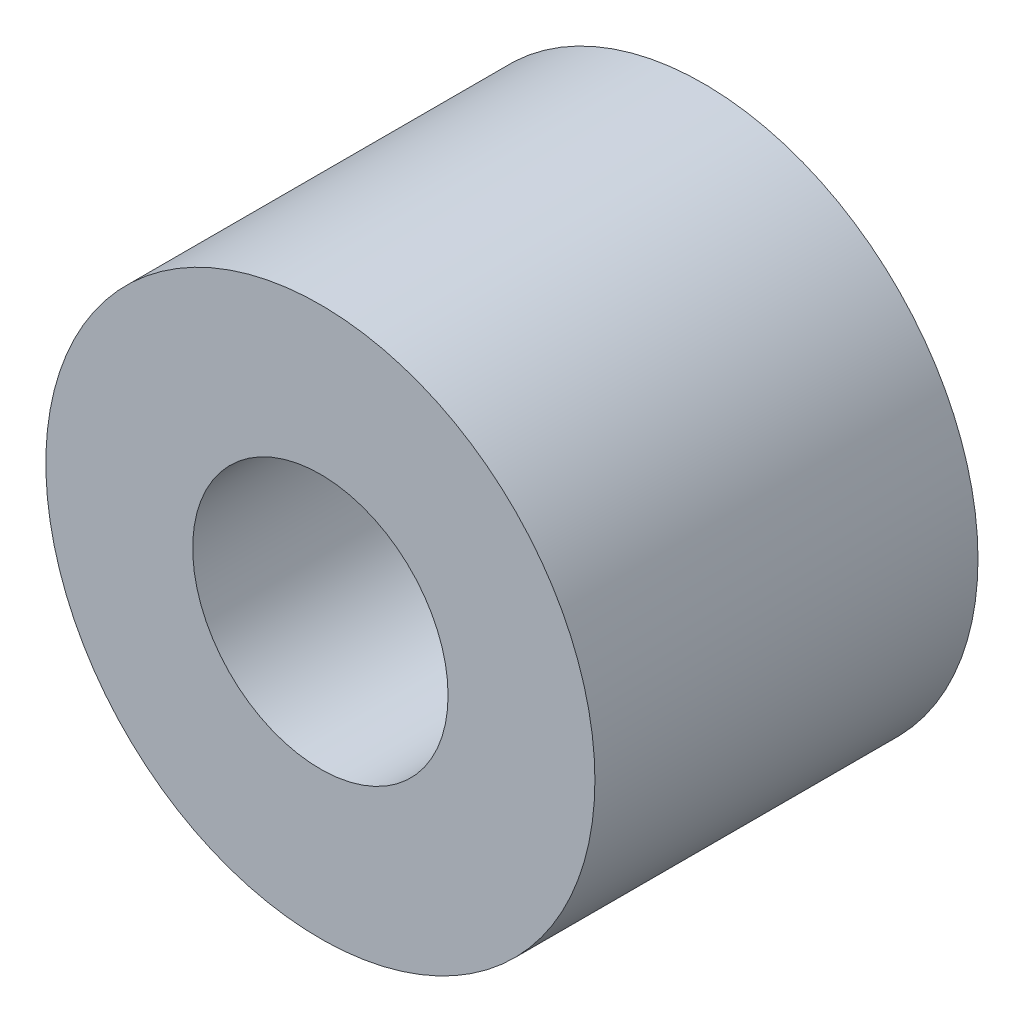
ISO-10303-21;
HEADER;
FILE_DESCRIPTION(('STEP AP214'),'2;1');
FILE_NAME('part.step','',(''),(''),'','','');
FILE_SCHEMA(('AUTOMOTIVE_DESIGN { 1 0 10303 214 1 1 1 1 }'));
ENDSEC;
DATA;
#1=APPLICATION_CONTEXT('core data for automotive mechanical design processes');
#2=APPLICATION_PROTOCOL_DEFINITION('international standard','automotive_design',2000,#1);
#3=PRODUCT_CONTEXT('',#1,'mechanical');
#4=PRODUCT('Part','Part','',(#3));
#5=PRODUCT_RELATED_PRODUCT_CATEGORY('part','',(#4));
#6=PRODUCT_DEFINITION_FORMATION('','',#4);
#7=PRODUCT_DEFINITION_CONTEXT('part definition',#1,'design');
#8=PRODUCT_DEFINITION('design','',#6,#7);
#9=PRODUCT_DEFINITION_SHAPE('','',#8);
#10=(LENGTH_UNIT() NAMED_UNIT(*) SI_UNIT(.MILLI.,.METRE.));
#11=(NAMED_UNIT(*) PLANE_ANGLE_UNIT() SI_UNIT($,.RADIAN.));
#12=(NAMED_UNIT(*) SI_UNIT($,.STERADIAN.) SOLID_ANGLE_UNIT());
#13=UNCERTAINTY_MEASURE_WITH_UNIT(LENGTH_MEASURE(1.E-05),#10,'distance_accuracy_value','');
#14=(GEOMETRIC_REPRESENTATION_CONTEXT(3) GLOBAL_UNCERTAINTY_ASSIGNED_CONTEXT((#13)) GLOBAL_UNIT_ASSIGNED_CONTEXT((#10,
#11,#12)) REPRESENTATION_CONTEXT('',''));
#15=CARTESIAN_POINT('',(0.,0.,0.));
#16=DIRECTION('',(0.,0.,1.));
#17=DIRECTION('',(1.,0.,0.));
#18=AXIS2_PLACEMENT_3D('',#15,#16,#17);
#19=CARTESIAN_POINT('',(0.,0.,762.));
#20=DIRECTION('',(0.,0.,-1.));
#21=DIRECTION('',(-1.,0.,0.));
#22=AXIS2_PLACEMENT_3D('',#19,#20,#21);
#23=CYLINDRICAL_SURFACE('',#22,546.1);
#24=CARTESIAN_POINT('',(0.,0.,762.));
#25=DIRECTION('',(0.,0.,1.));
#26=DIRECTION('',(1.,0.,0.));
#27=AXIS2_PLACEMENT_3D('',#24,#25,#26);
#28=CIRCLE('',#27,546.1);
#29=CARTESIAN_POINT('',(546.1,0.,762.));
#30=VERTEX_POINT('',#29);
#31=EDGE_CURVE('E10',#30,#30,#28,.T.);
#32=ORIENTED_EDGE('',*,*,#31,.F.);
#33=EDGE_LOOP('',(#32));
#34=FACE_BOUND('',#33,.T.);
#35=CARTESIAN_POINT('',(0.,0.,0.));
#36=DIRECTION('',(0.,0.,1.));
#37=DIRECTION('',(1.,0.,0.));
#38=AXIS2_PLACEMENT_3D('',#35,#36,#37);
#39=CIRCLE('',#38,546.1);
#40=CARTESIAN_POINT('',(546.1,0.,0.));
#41=VERTEX_POINT('',#40);
#42=EDGE_CURVE('E33',#41,#41,#39,.T.);
#43=ORIENTED_EDGE('',*,*,#42,.T.);
#44=EDGE_LOOP('',(#43));
#45=FACE_BOUND('',#44,.T.);
#46=ADVANCED_FACE('F30',(#34,#45),#23,.T.);
#47=CARTESIAN_POINT('',(0.,0.,762.));
#48=DIRECTION('',(0.,0.,1.));
#49=DIRECTION('',(1.,0.,0.));
#50=AXIS2_PLACEMENT_3D('',#47,#48,#49);
#51=PLANE('',#50);
#52=CARTESIAN_POINT('',(0.,0.,762.));
#53=DIRECTION('',(0.,0.,1.));
#54=DIRECTION('',(1.,0.,0.));
#55=AXIS2_PLACEMENT_3D('',#52,#53,#54);
#56=CIRCLE('',#55,254.);
#57=CARTESIAN_POINT('',(254.,0.,762.));
#58=VERTEX_POINT('',#57);
#59=EDGE_CURVE('E42',#58,#58,#56,.T.);
#60=ORIENTED_EDGE('',*,*,#59,.F.);
#61=EDGE_LOOP('',(#60));
#62=FACE_BOUND('',#61,.T.);
#63=ORIENTED_EDGE('',*,*,#31,.T.);
#64=EDGE_LOOP('',(#63));
#65=FACE_BOUND('',#64,.T.);
#66=ADVANCED_FACE('F57',(#62,#65),#51,.T.);
#67=CARTESIAN_POINT('',(0.,0.,0.));
#68=DIRECTION('',(0.,0.,1.));
#69=DIRECTION('',(1.,0.,0.));
#70=AXIS2_PLACEMENT_3D('',#67,#68,#69);
#71=PLANE('',#70);
#72=CARTESIAN_POINT('',(0.,0.,0.));
#73=DIRECTION('',(0.,0.,1.));
#74=DIRECTION('',(1.,0.,0.));
#75=AXIS2_PLACEMENT_3D('',#72,#73,#74);
#76=CIRCLE('',#75,254.);
#77=CARTESIAN_POINT('',(254.,0.,0.));
#78=VERTEX_POINT('',#77);
#79=EDGE_CURVE('E40',#78,#78,#76,.T.);
#80=ORIENTED_EDGE('',*,*,#79,.T.);
#81=EDGE_LOOP('',(#80));
#82=FACE_BOUND('',#81,.T.);
#83=ORIENTED_EDGE('',*,*,#42,.F.);
#84=EDGE_LOOP('',(#83));
#85=FACE_BOUND('',#84,.T.);
#86=ADVANCED_FACE('F48',(#82,#85),#71,.F.);
#87=CARTESIAN_POINT('',(0.,0.,0.));
#88=DIRECTION('',(0.,0.,1.));
#89=DIRECTION('',(1.,0.,0.));
#90=AXIS2_PLACEMENT_3D('',#87,#88,#89);
#91=CYLINDRICAL_SURFACE('',#90,254.);
#92=ORIENTED_EDGE('',*,*,#79,.F.);
#93=EDGE_LOOP('',(#92));
#94=FACE_BOUND('',#93,.T.);
#95=ORIENTED_EDGE('',*,*,#59,.T.);
#96=EDGE_LOOP('',(#95));
#97=FACE_BOUND('',#96,.T.);
#98=ADVANCED_FACE('F51',(#94,#97),#91,.F.);
#99=CLOSED_SHELL('',(#46,#66,#86,#98));
#100=MANIFOLD_SOLID_BREP('B2',#99);
#101=ADVANCED_BREP_SHAPE_REPRESENTATION('',(#18,#100),#14);
#102=SHAPE_DEFINITION_REPRESENTATION(#9,#101);
ENDSEC;
END-ISO-10303-21;
